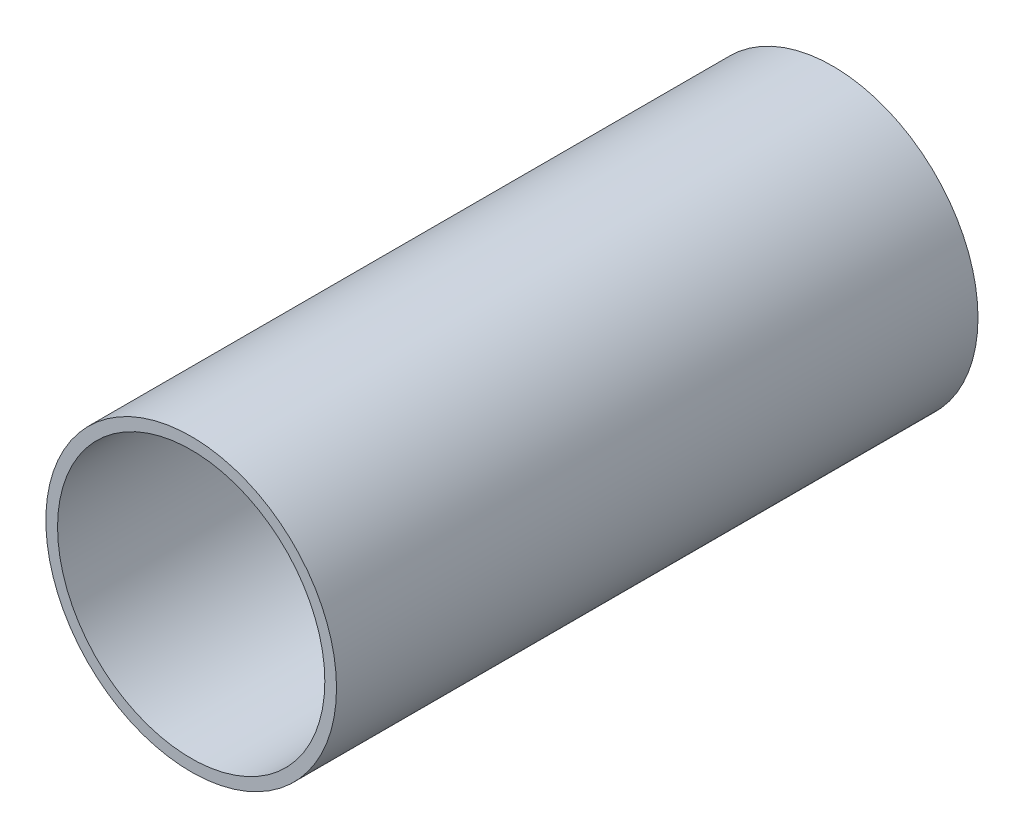
ISO-10303-21;
HEADER;
FILE_DESCRIPTION(('STEP AP214'),'2;1');
FILE_NAME('part.step','',(''),(''),'','','');
FILE_SCHEMA(('AUTOMOTIVE_DESIGN { 1 0 10303 214 1 1 1 1 }'));
ENDSEC;
DATA;
#1=APPLICATION_CONTEXT('core data for automotive mechanical design processes');
#2=APPLICATION_PROTOCOL_DEFINITION('international standard','automotive_design',2000,#1);
#3=PRODUCT_CONTEXT('',#1,'mechanical');
#4=PRODUCT('Part','Part','',(#3));
#5=PRODUCT_RELATED_PRODUCT_CATEGORY('part','',(#4));
#6=PRODUCT_DEFINITION_FORMATION('','',#4);
#7=PRODUCT_DEFINITION_CONTEXT('part definition',#1,'design');
#8=PRODUCT_DEFINITION('design','',#6,#7);
#9=PRODUCT_DEFINITION_SHAPE('','',#8);
#10=(LENGTH_UNIT() NAMED_UNIT(*) SI_UNIT(.MILLI.,.METRE.));
#11=(NAMED_UNIT(*) PLANE_ANGLE_UNIT() SI_UNIT($,.RADIAN.));
#12=(NAMED_UNIT(*) SI_UNIT($,.STERADIAN.) SOLID_ANGLE_UNIT());
#13=UNCERTAINTY_MEASURE_WITH_UNIT(LENGTH_MEASURE(1.E-05),#10,'distance_accuracy_value','');
#14=(GEOMETRIC_REPRESENTATION_CONTEXT(3) GLOBAL_UNCERTAINTY_ASSIGNED_CONTEXT((#13)) GLOBAL_UNIT_ASSIGNED_CONTEXT((#10,
#11,#12)) REPRESENTATION_CONTEXT('',''));
#15=CARTESIAN_POINT('',(0.,0.,0.));
#16=DIRECTION('',(0.,0.,1.));
#17=DIRECTION('',(1.,0.,0.));
#18=AXIS2_PLACEMENT_3D('',#15,#16,#17);
#19=CARTESIAN_POINT('',(0.,0.,192.));
#20=DIRECTION('',(0.,0.,1.));
#21=DIRECTION('',(1.,0.,0.));
#22=AXIS2_PLACEMENT_3D('',#19,#20,#21);
#23=PLANE('',#22);
#24=CARTESIAN_POINT('',(0.,0.,192.));
#25=DIRECTION('',(0.,0.,1.));
#26=DIRECTION('',(1.,0.,0.));
#27=AXIS2_PLACEMENT_3D('',#24,#25,#26);
#28=CIRCLE('',#27,43.5);
#29=CARTESIAN_POINT('',(43.5,0.,192.));
#30=VERTEX_POINT('',#29);
#31=EDGE_CURVE('E10',#30,#30,#28,.T.);
#32=ORIENTED_EDGE('',*,*,#31,.T.);
#33=EDGE_LOOP('',(#32));
#34=FACE_BOUND('',#33,.T.);
#35=CARTESIAN_POINT('',(0.,0.,192.));
#36=DIRECTION('',(0.,0.,1.));
#37=DIRECTION('',(1.,0.,0.));
#38=AXIS2_PLACEMENT_3D('',#35,#36,#37);
#39=CIRCLE('',#38,40.);
#40=CARTESIAN_POINT('',(40.,0.,192.));
#41=VERTEX_POINT('',#40);
#42=EDGE_CURVE('E41',#41,#41,#39,.T.);
#43=ORIENTED_EDGE('',*,*,#42,.F.);
#44=EDGE_LOOP('',(#43));
#45=FACE_BOUND('',#44,.T.);
#46=ADVANCED_FACE('F30',(#34,#45),#23,.T.);
#47=CARTESIAN_POINT('',(0.,0.,0.));
#48=DIRECTION('',(0.,0.,1.));
#49=DIRECTION('',(1.,0.,0.));
#50=AXIS2_PLACEMENT_3D('',#47,#48,#49);
#51=PLANE('',#50);
#52=CARTESIAN_POINT('',(0.,0.,0.));
#53=DIRECTION('',(0.,0.,1.));
#54=DIRECTION('',(1.,0.,0.));
#55=AXIS2_PLACEMENT_3D('',#52,#53,#54);
#56=CIRCLE('',#55,43.5);
#57=CARTESIAN_POINT('',(43.5,0.,0.));
#58=VERTEX_POINT('',#57);
#59=EDGE_CURVE('E34',#58,#58,#56,.T.);
#60=ORIENTED_EDGE('',*,*,#59,.F.);
#61=EDGE_LOOP('',(#60));
#62=FACE_BOUND('',#61,.T.);
#63=CARTESIAN_POINT('',(0.,0.,0.));
#64=DIRECTION('',(0.,0.,1.));
#65=DIRECTION('',(1.,0.,0.));
#66=AXIS2_PLACEMENT_3D('',#63,#64,#65);
#67=CIRCLE('',#66,40.);
#68=CARTESIAN_POINT('',(40.,0.,0.));
#69=VERTEX_POINT('',#68);
#70=EDGE_CURVE('E43',#69,#69,#67,.T.);
#71=ORIENTED_EDGE('',*,*,#70,.T.);
#72=EDGE_LOOP('',(#71));
#73=FACE_BOUND('',#72,.T.);
#74=ADVANCED_FACE('F53',(#62,#73),#51,.F.);
#75=CARTESIAN_POINT('',(0.,0.,192.));
#76=DIRECTION('',(0.,0.,-1.));
#77=DIRECTION('',(-1.,0.,0.));
#78=AXIS2_PLACEMENT_3D('',#75,#76,#77);
#79=CYLINDRICAL_SURFACE('',#78,43.5);
#80=ORIENTED_EDGE('',*,*,#31,.F.);
#81=EDGE_LOOP('',(#80));
#82=FACE_BOUND('',#81,.T.);
#83=ORIENTED_EDGE('',*,*,#59,.T.);
#84=EDGE_LOOP('',(#83));
#85=FACE_BOUND('',#84,.T.);
#86=ADVANCED_FACE('F32',(#82,#85),#79,.T.);
#87=CARTESIAN_POINT('',(0.,0.,192.));
#88=DIRECTION('',(0.,0.,-1.));
#89=DIRECTION('',(-1.,0.,0.));
#90=AXIS2_PLACEMENT_3D('',#87,#88,#89);
#91=CYLINDRICAL_SURFACE('',#90,40.);
#92=ORIENTED_EDGE('',*,*,#42,.T.);
#93=EDGE_LOOP('',(#92));
#94=FACE_BOUND('',#93,.T.);
#95=ORIENTED_EDGE('',*,*,#70,.F.);
#96=EDGE_LOOP('',(#95));
#97=FACE_BOUND('',#96,.T.);
#98=ADVANCED_FACE('F49',(#94,#97),#91,.F.);
#99=CLOSED_SHELL('',(#46,#74,#86,#98));
#100=MANIFOLD_SOLID_BREP('B2',#99);
#101=ADVANCED_BREP_SHAPE_REPRESENTATION('',(#18,#100),#14);
#102=SHAPE_DEFINITION_REPRESENTATION(#9,#101);
ENDSEC;
END-ISO-10303-21;
